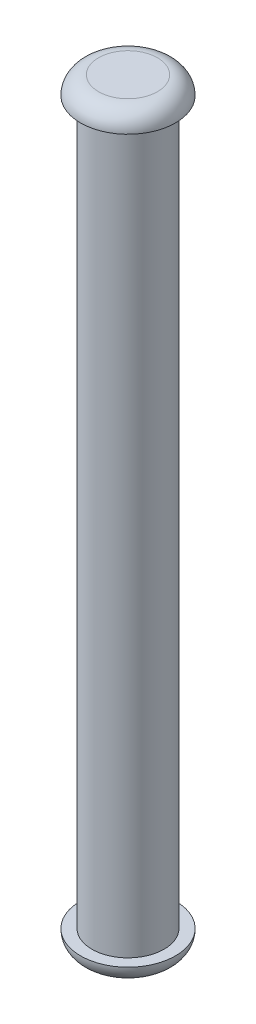
ISO-10303-21;
HEADER;
FILE_DESCRIPTION(('STEP AP214'),'2;1');
FILE_NAME('part.step','',(''),(''),'','','');
FILE_SCHEMA(('AUTOMOTIVE_DESIGN { 1 0 10303 214 1 1 1 1 }'));
ENDSEC;
DATA;
#1=APPLICATION_CONTEXT('core data for automotive mechanical design processes');
#2=APPLICATION_PROTOCOL_DEFINITION('international standard','automotive_design',2000,#1);
#3=PRODUCT_CONTEXT('',#1,'mechanical');
#4=PRODUCT('Part','Part','',(#3));
#5=PRODUCT_RELATED_PRODUCT_CATEGORY('part','',(#4));
#6=PRODUCT_DEFINITION_FORMATION('','',#4);
#7=PRODUCT_DEFINITION_CONTEXT('part definition',#1,'design');
#8=PRODUCT_DEFINITION('design','',#6,#7);
#9=PRODUCT_DEFINITION_SHAPE('','',#8);
#10=(LENGTH_UNIT() NAMED_UNIT(*) SI_UNIT(.MILLI.,.METRE.));
#11=(NAMED_UNIT(*) PLANE_ANGLE_UNIT() SI_UNIT($,.RADIAN.));
#12=(NAMED_UNIT(*) SI_UNIT($,.STERADIAN.) SOLID_ANGLE_UNIT());
#13=UNCERTAINTY_MEASURE_WITH_UNIT(LENGTH_MEASURE(1.E-05),#10,'distance_accuracy_value','');
#14=(GEOMETRIC_REPRESENTATION_CONTEXT(3) GLOBAL_UNCERTAINTY_ASSIGNED_CONTEXT((#13)) GLOBAL_UNIT_ASSIGNED_CONTEXT((#10,
#11,#12)) REPRESENTATION_CONTEXT('',''));
#15=CARTESIAN_POINT('',(0.,0.,0.));
#16=DIRECTION('',(0.,0.,1.));
#17=DIRECTION('',(1.,0.,0.));
#18=AXIS2_PLACEMENT_3D('',#15,#16,#17);
#19=CARTESIAN_POINT('',(0.,40.,0.));
#20=DIRECTION('',(0.,-1.,0.));
#21=DIRECTION('',(0.,0.,-1.));
#22=AXIS2_PLACEMENT_3D('',#19,#20,#21);
#23=CYLINDRICAL_SURFACE('',#22,2.);
#24=CARTESIAN_POINT('',(0.,40.,0.));
#25=DIRECTION('',(0.,1.,0.));
#26=DIRECTION('',(0.,0.,1.));
#27=AXIS2_PLACEMENT_3D('',#24,#25,#26);
#28=CIRCLE('',#27,2.);
#29=CARTESIAN_POINT('',(0.,40.,2.));
#30=VERTEX_POINT('',#29);
#31=EDGE_CURVE('E46',#30,#30,#28,.T.);
#32=ORIENTED_EDGE('',*,*,#31,.F.);
#33=EDGE_LOOP('',(#32));
#34=FACE_BOUND('',#33,.T.);
#35=CARTESIAN_POINT('',(0.,0.,0.));
#36=DIRECTION('',(0.,-1.,0.));
#37=DIRECTION('',(0.,0.,-1.));
#38=AXIS2_PLACEMENT_3D('',#35,#36,#37);
#39=CIRCLE('',#38,2.);
#40=CARTESIAN_POINT('',(0.,0.,-2.));
#41=VERTEX_POINT('',#40);
#42=EDGE_CURVE('E55',#41,#41,#39,.T.);
#43=ORIENTED_EDGE('',*,*,#42,.F.);
#44=EDGE_LOOP('',(#43));
#45=FACE_BOUND('',#44,.T.);
#46=ADVANCED_FACE('F35',(#34,#45),#23,.T.);
#47=CARTESIAN_POINT('',(0.,41.,0.));
#48=DIRECTION('',(0.,1.,0.));
#49=DIRECTION('',(0.,0.,1.));
#50=AXIS2_PLACEMENT_3D('',#47,#48,#49);
#51=PLANE('',#50);
#52=CARTESIAN_POINT('',(0.,41.,0.));
#53=DIRECTION('',(0.,1.,0.));
#54=DIRECTION('',(0.,0.,1.));
#55=AXIS2_PLACEMENT_3D('',#52,#53,#54);
#56=CIRCLE('',#55,1.63308596646539);
#57=CARTESIAN_POINT('',(0.,41.,1.63308596646539));
#58=VERTEX_POINT('',#57);
#59=EDGE_CURVE('E42',#58,#58,#56,.T.);
#60=ORIENTED_EDGE('',*,*,#59,.T.);
#61=EDGE_LOOP('',(#60));
#62=FACE_BOUND('',#61,.T.);
#63=ADVANCED_FACE('F78',(#62),#51,.T.);
#64=CARTESIAN_POINT('',(0.,40.,0.));
#65=DIRECTION('',(0.,1.,0.));
#66=DIRECTION('',(0.,0.,1.));
#67=AXIS2_PLACEMENT_3D('',#64,#65,#66);
#68=PLANE('',#67);
#69=ORIENTED_EDGE('',*,*,#31,.T.);
#70=EDGE_LOOP('',(#69));
#71=FACE_BOUND('',#70,.T.);
#72=CARTESIAN_POINT('',(0.,40.,0.));
#73=DIRECTION('',(0.,1.,0.));
#74=DIRECTION('',(0.,0.,1.));
#75=AXIS2_PLACEMENT_3D('',#72,#73,#74);
#76=CIRCLE('',#75,2.63308596646539);
#77=CARTESIAN_POINT('',(0.,40.,2.63308596646539));
#78=VERTEX_POINT('',#77);
#79=EDGE_CURVE('E50',#78,#78,#76,.T.);
#80=ORIENTED_EDGE('',*,*,#79,.F.);
#81=EDGE_LOOP('',(#80));
#82=FACE_BOUND('',#81,.T.);
#83=ADVANCED_FACE('F85',(#71,#82),#68,.F.);
#84=CARTESIAN_POINT('',(0.,40.,0.));
#85=DIRECTION('',(0.,1.,0.));
#86=DIRECTION('',(0.,0.,1.));
#87=AXIS2_PLACEMENT_3D('',#84,#85,#86);
#88=TOROIDAL_SURFACE('',#87,1.63308596646539,1.);
#89=ORIENTED_EDGE('',*,*,#79,.T.);
#90=EDGE_LOOP('',(#89));
#91=FACE_BOUND('',#90,.T.);
#92=ORIENTED_EDGE('',*,*,#59,.F.);
#93=EDGE_LOOP('',(#92));
#94=FACE_BOUND('',#93,.T.);
#95=ADVANCED_FACE('F74',(#91,#94),#88,.T.);
#96=CARTESIAN_POINT('',(0.,-1.,0.));
#97=DIRECTION('',(0.,-1.,0.));
#98=DIRECTION('',(0.,0.,-1.));
#99=AXIS2_PLACEMENT_3D('',#96,#97,#98);
#100=PLANE('',#99);
#101=CARTESIAN_POINT('',(0.,-1.,0.));
#102=DIRECTION('',(0.,-1.,0.));
#103=DIRECTION('',(0.,0.,-1.));
#104=AXIS2_PLACEMENT_3D('',#101,#102,#103);
#105=CIRCLE('',#104,1.63308596646539);
#106=CARTESIAN_POINT('',(0.,-1.,-1.63308596646539));
#107=VERTEX_POINT('',#106);
#108=EDGE_CURVE('E10',#107,#107,#105,.T.);
#109=ORIENTED_EDGE('',*,*,#108,.T.);
#110=EDGE_LOOP('',(#109));
#111=FACE_BOUND('',#110,.T.);
#112=ADVANCED_FACE('F66',(#111),#100,.T.);
#113=CARTESIAN_POINT('',(0.,0.,0.));
#114=DIRECTION('',(0.,-1.,0.));
#115=DIRECTION('',(0.,0.,-1.));
#116=AXIS2_PLACEMENT_3D('',#113,#114,#115);
#117=PLANE('',#116);
#118=ORIENTED_EDGE('',*,*,#42,.T.);
#119=EDGE_LOOP('',(#118));
#120=FACE_BOUND('',#119,.T.);
#121=CARTESIAN_POINT('',(0.,0.,0.));
#122=DIRECTION('',(0.,-1.,0.));
#123=DIRECTION('',(0.,0.,-1.));
#124=AXIS2_PLACEMENT_3D('',#121,#122,#123);
#125=CIRCLE('',#124,2.63308596646539);
#126=CARTESIAN_POINT('',(0.,0.,-2.63308596646539));
#127=VERTEX_POINT('',#126);
#128=EDGE_CURVE('E58',#127,#127,#125,.T.);
#129=ORIENTED_EDGE('',*,*,#128,.F.);
#130=EDGE_LOOP('',(#129));
#131=FACE_BOUND('',#130,.T.);
#132=ADVANCED_FACE('F64',(#120,#131),#117,.F.);
#133=CARTESIAN_POINT('',(0.,0.,0.));
#134=DIRECTION('',(0.,-1.,0.));
#135=DIRECTION('',(0.,0.,-1.));
#136=AXIS2_PLACEMENT_3D('',#133,#134,#135);
#137=TOROIDAL_SURFACE('',#136,1.63308596646539,1.);
#138=ORIENTED_EDGE('',*,*,#128,.T.);
#139=EDGE_LOOP('',(#138));
#140=FACE_BOUND('',#139,.T.);
#141=ORIENTED_EDGE('',*,*,#108,.F.);
#142=EDGE_LOOP('',(#141));
#143=FACE_BOUND('',#142,.T.);
#144=ADVANCED_FACE('F37',(#140,#143),#137,.T.);
#145=CLOSED_SHELL('',(#46,#63,#83,#95,#112,#132,#144));
#146=MANIFOLD_SOLID_BREP('B2',#145);
#147=ADVANCED_BREP_SHAPE_REPRESENTATION('',(#18,#146),#14);
#148=SHAPE_DEFINITION_REPRESENTATION(#9,#147);
ENDSEC;
END-ISO-10303-21;
